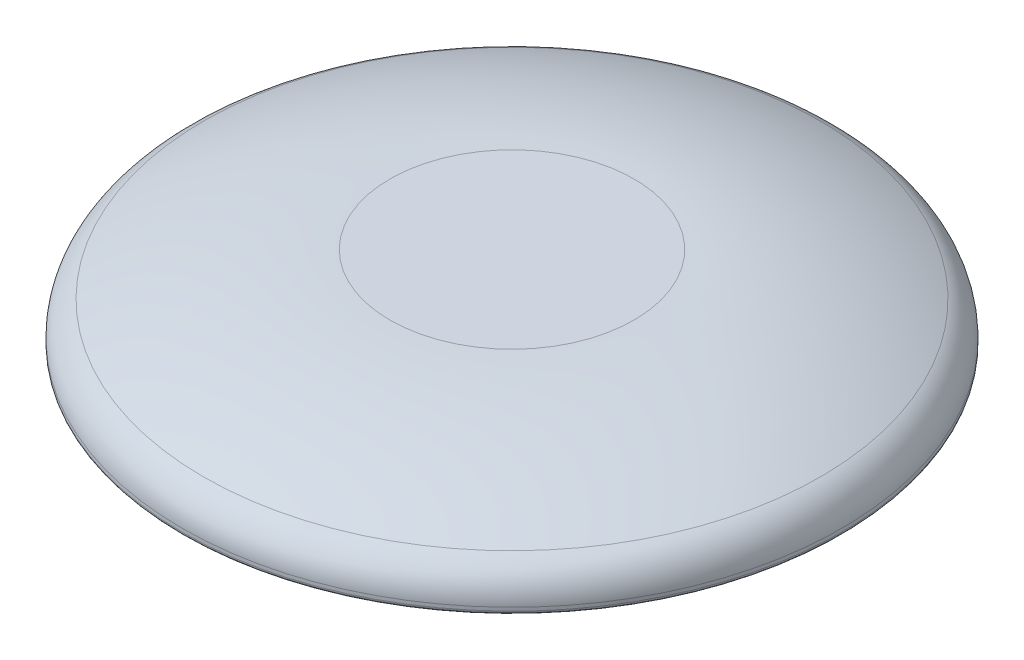
ISO-10303-21;
HEADER;
FILE_DESCRIPTION(('STEP AP214'),'2;1');
FILE_NAME('part.step','',(''),(''),'','','');
FILE_SCHEMA(('AUTOMOTIVE_DESIGN { 1 0 10303 214 1 1 1 1 }'));
ENDSEC;
DATA;
#1=APPLICATION_CONTEXT('core data for automotive mechanical design processes');
#2=APPLICATION_PROTOCOL_DEFINITION('international standard','automotive_design',2000,#1);
#3=PRODUCT_CONTEXT('',#1,'mechanical');
#4=PRODUCT('Part','Part','',(#3));
#5=PRODUCT_RELATED_PRODUCT_CATEGORY('part','',(#4));
#6=PRODUCT_DEFINITION_FORMATION('','',#4);
#7=PRODUCT_DEFINITION_CONTEXT('part definition',#1,'design');
#8=PRODUCT_DEFINITION('design','',#6,#7);
#9=PRODUCT_DEFINITION_SHAPE('','',#8);
#10=(LENGTH_UNIT() NAMED_UNIT(*) SI_UNIT(.MILLI.,.METRE.));
#11=(NAMED_UNIT(*) PLANE_ANGLE_UNIT() SI_UNIT($,.RADIAN.));
#12=(NAMED_UNIT(*) SI_UNIT($,.STERADIAN.) SOLID_ANGLE_UNIT());
#13=UNCERTAINTY_MEASURE_WITH_UNIT(LENGTH_MEASURE(1.E-05),#10,'distance_accuracy_value','');
#14=(GEOMETRIC_REPRESENTATION_CONTEXT(3) GLOBAL_UNCERTAINTY_ASSIGNED_CONTEXT((#13)) GLOBAL_UNIT_ASSIGNED_CONTEXT((#10,
#11,#12)) REPRESENTATION_CONTEXT('',''));
#15=CARTESIAN_POINT('',(0.,0.,0.));
#16=DIRECTION('',(0.,0.,1.));
#17=DIRECTION('',(1.,0.,0.));
#18=AXIS2_PLACEMENT_3D('',#15,#16,#17);
#19=CARTESIAN_POINT('',(3.03923552991137E-12,-144.928089888096,0.));
#20=DIRECTION('',(0.,1.,0.));
#21=DIRECTION('',(0.,0.,1.));
#22=AXIS2_PLACEMENT_3D('',#19,#20,#21);
#23=DEGENERATE_TOROIDAL_SURFACE('',#22,51.7833584030336,175.662089888106,.T.);
#24=CARTESIAN_POINT('',(3.03923552991137E-12,30.7340000000103,0.));
#25=DIRECTION('',(0.,1.,0.));
#26=DIRECTION('',(0.,0.,1.));
#27=AXIS2_PLACEMENT_3D('',#24,#25,#26);
#28=CIRCLE('',#27,51.7833584030336);
#29=CARTESIAN_POINT('',(3.03923552991137E-12,30.7340000000103,51.7833584030336));
#30=VERTEX_POINT('',#29);
#31=EDGE_CURVE('E64',#30,#30,#28,.T.);
#32=ORIENTED_EDGE('',*,*,#31,.T.);
#33=EDGE_LOOP('',(#32));
#34=FACE_BOUND('',#33,.T.);
#35=CARTESIAN_POINT('',(3.03923552991137E-12,13.0554372771287,0.));
#36=DIRECTION('',(0.,1.,0.));
#37=DIRECTION('',(0.,0.,1.));
#38=AXIS2_PLACEMENT_3D('',#35,#36,#37);
#39=CIRCLE('',#38,128.584237097825);
#40=CARTESIAN_POINT('',(3.03923552991137E-12,13.0554372771287,128.584237097825));
#41=VERTEX_POINT('',#40);
#42=EDGE_CURVE('E10',#41,#41,#39,.T.);
#43=ORIENTED_EDGE('',*,*,#42,.F.);
#44=EDGE_LOOP('',(#43));
#45=FACE_BOUND('',#44,.T.);
#46=ADVANCED_FACE('F30',(#34,#45),#23,.F.);
#47=CARTESIAN_POINT('',(3.03923552991137E-12,3.0041854633595,0.));
#48=DIRECTION('',(0.,1.,0.));
#49=DIRECTION('',(0.,0.,1.));
#50=AXIS2_PLACEMENT_3D('',#47,#48,#49);
#51=TOROIDAL_SURFACE('',#50,123.697999999997,11.1759999999994);
#52=ORIENTED_EDGE('',*,*,#42,.T.);
#53=EDGE_LOOP('',(#52));
#54=FACE_BOUND('',#53,.T.);
#55=CARTESIAN_POINT('',(3.03923552991137E-12,3.0041854633595,0.));
#56=DIRECTION('',(0.,1.,0.));
#57=DIRECTION('',(0.,0.,1.));
#58=AXIS2_PLACEMENT_3D('',#55,#56,#57);
#59=CIRCLE('',#58,134.873999999997);
#60=CARTESIAN_POINT('',(3.03923552991137E-12,3.0041854633595,134.873999999997));
#61=VERTEX_POINT('',#60);
#62=EDGE_CURVE('E36',#61,#61,#59,.T.);
#63=ORIENTED_EDGE('',*,*,#62,.F.);
#64=EDGE_LOOP('',(#63));
#65=FACE_BOUND('',#64,.T.);
#66=ADVANCED_FACE('F81',(#54,#65),#51,.F.);
#67=CARTESIAN_POINT('',(3.03923552991137E-12,1.02418074021671E-11,0.));
#68=DIRECTION('',(0.,1.,0.));
#69=DIRECTION('',(0.,0.,1.));
#70=AXIS2_PLACEMENT_3D('',#67,#68,#69);
#71=CYLINDRICAL_SURFACE('',#70,134.873999999997);
#72=ORIENTED_EDGE('',*,*,#62,.T.);
#73=EDGE_LOOP('',(#72));
#74=FACE_BOUND('',#73,.T.);
#75=CARTESIAN_POINT('',(3.03923552991137E-12,1.6002,0.));
#76=DIRECTION('',(0.,1.,0.));
#77=DIRECTION('',(0.,0.,1.));
#78=AXIS2_PLACEMENT_3D('',#75,#76,#77);
#79=CIRCLE('',#78,134.873999999997);
#80=CARTESIAN_POINT('',(3.03923552991137E-12,1.6002,134.873999999997));
#81=VERTEX_POINT('',#80);
#82=EDGE_CURVE('E40',#81,#81,#79,.T.);
#83=ORIENTED_EDGE('',*,*,#82,.F.);
#84=EDGE_LOOP('',(#83));
#85=FACE_BOUND('',#84,.T.);
#86=ADVANCED_FACE('F85',(#74,#85),#71,.F.);
#87=CARTESIAN_POINT('',(3.02535774210355E-12,1.6002,0.));
#88=DIRECTION('',(0.,1.,0.));
#89=DIRECTION('',(0.,0.,1.));
#90=AXIS2_PLACEMENT_3D('',#87,#88,#89);
#91=TOROIDAL_SURFACE('',#90,136.474199999997,1.60020000000001);
#92=ORIENTED_EDGE('',*,*,#82,.T.);
#93=EDGE_LOOP('',(#92));
#94=FACE_BOUND('',#93,.T.);
#95=CARTESIAN_POINT('',(3.03923552991137E-12,0.,0.));
#96=DIRECTION('',(0.,1.,0.));
#97=DIRECTION('',(0.,0.,1.));
#98=AXIS2_PLACEMENT_3D('',#95,#96,#97);
#99=CIRCLE('',#98,136.474199999997);
#100=CARTESIAN_POINT('',(3.03923552991137E-12,0.,136.474199999997));
#101=VERTEX_POINT('',#100);
#102=EDGE_CURVE('E44',#101,#101,#99,.T.);
#103=ORIENTED_EDGE('',*,*,#102,.F.);
#104=EDGE_LOOP('',(#103));
#105=FACE_BOUND('',#104,.T.);
#106=ADVANCED_FACE('F89',(#94,#105),#91,.T.);
#107=CARTESIAN_POINT('',(138.0998,0.,0.));
#108=DIRECTION('',(0.,-1.,0.));
#109=DIRECTION('',(0.,0.,-1.));
#110=AXIS2_PLACEMENT_3D('',#107,#108,#109);
#111=PLANE('',#110);
#112=ORIENTED_EDGE('',*,*,#102,.T.);
#113=EDGE_LOOP('',(#112));
#114=FACE_BOUND('',#113,.T.);
#115=CARTESIAN_POINT('',(3.03923552991137E-12,0.,0.));
#116=DIRECTION('',(0.,1.,0.));
#117=DIRECTION('',(0.,0.,1.));
#118=AXIS2_PLACEMENT_3D('',#115,#116,#117);
#119=CIRCLE('',#118,138.099799999997);
#120=CARTESIAN_POINT('',(3.03923552991137E-12,0.,138.099799999997));
#121=VERTEX_POINT('',#120);
#122=EDGE_CURVE('E49',#121,#121,#119,.T.);
#123=ORIENTED_EDGE('',*,*,#122,.F.);
#124=EDGE_LOOP('',(#123));
#125=FACE_BOUND('',#124,.T.);
#126=ADVANCED_FACE('F95',(#114,#125),#111,.T.);
#127=CARTESIAN_POINT('',(3.02535774210355E-12,1.6002,0.));
#128=DIRECTION('',(0.,1.,0.));
#129=DIRECTION('',(0.,0.,1.));
#130=AXIS2_PLACEMENT_3D('',#127,#128,#129);
#131=TOROIDAL_SURFACE('',#130,138.099799999997,1.6002);
#132=ORIENTED_EDGE('',*,*,#122,.T.);
#133=EDGE_LOOP('',(#132));
#134=FACE_BOUND('',#133,.T.);
#135=CARTESIAN_POINT('',(3.03923552991137E-12,1.6002,0.));
#136=DIRECTION('',(0.,1.,0.));
#137=DIRECTION('',(0.,0.,1.));
#138=AXIS2_PLACEMENT_3D('',#135,#136,#137);
#139=CIRCLE('',#138,139.699999999997);
#140=CARTESIAN_POINT('',(3.03923552991137E-12,1.6002,139.699999999997));
#141=VERTEX_POINT('',#140);
#142=EDGE_CURVE('E52',#141,#141,#139,.T.);
#143=ORIENTED_EDGE('',*,*,#142,.F.);
#144=EDGE_LOOP('',(#143));
#145=FACE_BOUND('',#144,.T.);
#146=ADVANCED_FACE('F99',(#134,#145),#131,.T.);
#147=CARTESIAN_POINT('',(3.03923552991137E-12,1.02418074021671E-11,0.));
#148=DIRECTION('',(0.,1.,0.));
#149=DIRECTION('',(0.,0.,1.));
#150=AXIS2_PLACEMENT_3D('',#147,#148,#149);
#151=CYLINDRICAL_SURFACE('',#150,139.699999999997);
#152=ORIENTED_EDGE('',*,*,#142,.T.);
#153=EDGE_LOOP('',(#152));
#154=FACE_BOUND('',#153,.T.);
#155=CARTESIAN_POINT('',(3.03923552991137E-12,3.0041854633595,0.));
#156=DIRECTION('',(0.,1.,0.));
#157=DIRECTION('',(0.,0.,1.));
#158=AXIS2_PLACEMENT_3D('',#155,#156,#157);
#159=CIRCLE('',#158,139.699999999996);
#160=CARTESIAN_POINT('',(3.03923552991137E-12,3.0041854633595,139.699999999996));
#161=VERTEX_POINT('',#160);
#162=EDGE_CURVE('E55',#161,#161,#159,.T.);
#163=ORIENTED_EDGE('',*,*,#162,.F.);
#164=EDGE_LOOP('',(#163));
#165=FACE_BOUND('',#164,.T.);
#166=ADVANCED_FACE('F103',(#154,#165),#151,.T.);
#167=CARTESIAN_POINT('',(3.03923552991137E-12,3.0041854633595,0.));
#168=DIRECTION('',(0.,1.,0.));
#169=DIRECTION('',(0.,0.,1.));
#170=AXIS2_PLACEMENT_3D('',#167,#168,#169);
#171=TOROIDAL_SURFACE('',#170,123.697999999997,16.0019999999994);
#172=ORIENTED_EDGE('',*,*,#162,.T.);
#173=EDGE_LOOP('',(#172));
#174=FACE_BOUND('',#173,.T.);
#175=CARTESIAN_POINT('',(3.03923552991137E-12,17.3957505603473,0.));
#176=DIRECTION('',(0.,1.,0.));
#177=DIRECTION('',(0.,0.,1.));
#178=AXIS2_PLACEMENT_3D('',#175,#176,#177);
#179=CIRCLE('',#178,130.69420311734);
#180=CARTESIAN_POINT('',(3.03923552991137E-12,17.3957505603473,130.69420311734));
#181=VERTEX_POINT('',#180);
#182=EDGE_CURVE('E58',#181,#181,#179,.T.);
#183=ORIENTED_EDGE('',*,*,#182,.F.);
#184=EDGE_LOOP('',(#183));
#185=FACE_BOUND('',#184,.T.);
#186=ADVANCED_FACE('F107',(#174,#185),#171,.T.);
#187=CARTESIAN_POINT('',(3.03923552991137E-12,-144.928089888096,0.));
#188=DIRECTION('',(0.,1.,0.));
#189=DIRECTION('',(0.,0.,1.));
#190=AXIS2_PLACEMENT_3D('',#187,#188,#189);
#191=DEGENERATE_TOROIDAL_SURFACE('',#190,51.7833584030336,180.488089888106,.T.);
#192=ORIENTED_EDGE('',*,*,#182,.T.);
#193=EDGE_LOOP('',(#192));
#194=FACE_BOUND('',#193,.T.);
#195=CARTESIAN_POINT('',(3.03923552991137E-12,35.5600000000102,0.));
#196=DIRECTION('',(0.,1.,0.));
#197=DIRECTION('',(0.,0.,1.));
#198=AXIS2_PLACEMENT_3D('',#195,#196,#197);
#199=CIRCLE('',#198,51.7833584030336);
#200=CARTESIAN_POINT('',(3.03923552991137E-12,35.5600000000102,51.7833584030336));
#201=VERTEX_POINT('',#200);
#202=EDGE_CURVE('E61',#201,#201,#199,.T.);
#203=ORIENTED_EDGE('',*,*,#202,.F.);
#204=EDGE_LOOP('',(#203));
#205=FACE_BOUND('',#204,.T.);
#206=ADVANCED_FACE('F77',(#194,#205),#191,.T.);
#207=CARTESIAN_POINT('',(3.03923552991137E-12,35.5600000000102,0.));
#208=DIRECTION('',(0.,1.,0.));
#209=DIRECTION('',(0.,0.,1.));
#210=AXIS2_PLACEMENT_3D('',#207,#208,#209);
#211=PLANE('',#210);
#212=ORIENTED_EDGE('',*,*,#202,.T.);
#213=EDGE_LOOP('',(#212));
#214=FACE_BOUND('',#213,.T.);
#215=ADVANCED_FACE('F72',(#214),#211,.T.);
#216=CARTESIAN_POINT('',(51.7833584030366,30.7340000000102,0.));
#217=DIRECTION('',(0.,-1.,0.));
#218=DIRECTION('',(0.,0.,-1.));
#219=AXIS2_PLACEMENT_3D('',#216,#217,#218);
#220=PLANE('',#219);
#221=ORIENTED_EDGE('',*,*,#31,.F.);
#222=EDGE_LOOP('',(#221));
#223=FACE_BOUND('',#222,.T.);
#224=ADVANCED_FACE('F70',(#223),#220,.T.);
#225=CLOSED_SHELL('',(#46,#66,#86,#106,#126,#146,#166,#186,#206,#215,#224));
#226=MANIFOLD_SOLID_BREP('B2',#225);
#227=ADVANCED_BREP_SHAPE_REPRESENTATION('',(#18,#226),#14);
#228=SHAPE_DEFINITION_REPRESENTATION(#9,#227);
ENDSEC;
END-ISO-10303-21;
